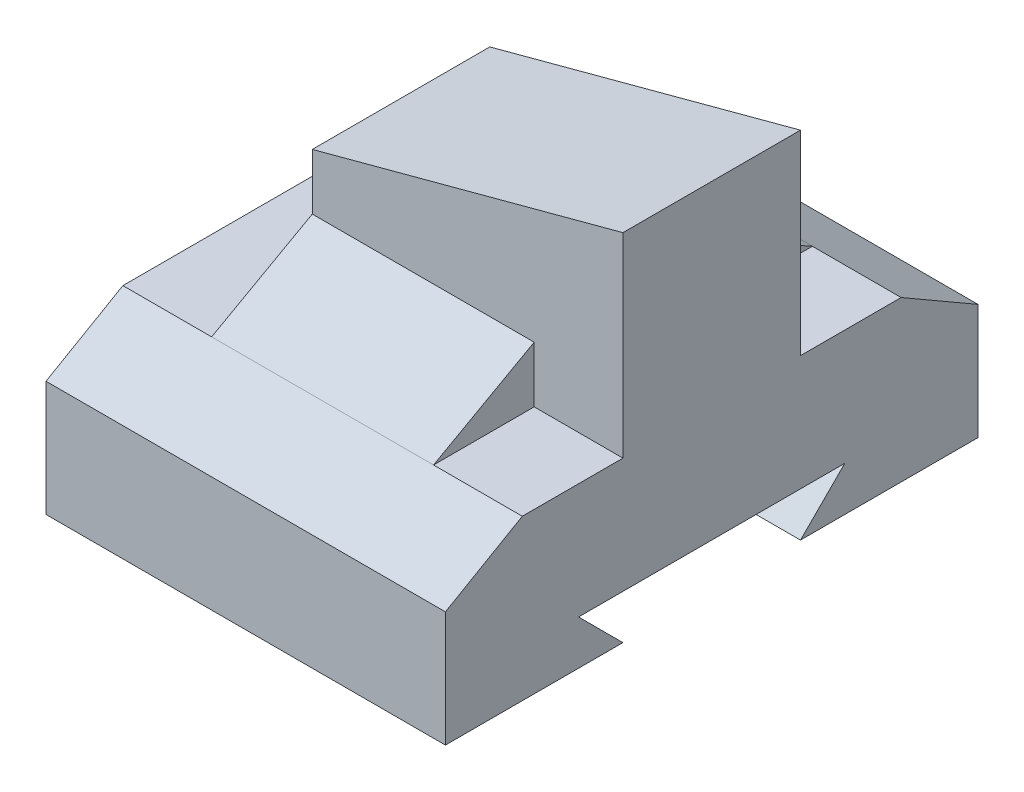
ISO-10303-21;
HEADER;
FILE_DESCRIPTION(('STEP AP214'),'2;1');
FILE_NAME('part.step','',(''),(''),'','','');
FILE_SCHEMA(('AUTOMOTIVE_DESIGN { 1 0 10303 214 1 1 1 1 }'));
ENDSEC;
DATA;
#1=APPLICATION_CONTEXT('core data for automotive mechanical design processes');
#2=APPLICATION_PROTOCOL_DEFINITION('international standard','automotive_design',2000,#1);
#3=PRODUCT_CONTEXT('',#1,'mechanical');
#4=PRODUCT('Part','Part','',(#3));
#5=PRODUCT_RELATED_PRODUCT_CATEGORY('part','',(#4));
#6=PRODUCT_DEFINITION_FORMATION('','',#4);
#7=PRODUCT_DEFINITION_CONTEXT('part definition',#1,'design');
#8=PRODUCT_DEFINITION('design','',#6,#7);
#9=PRODUCT_DEFINITION_SHAPE('','',#8);
#10=(LENGTH_UNIT() NAMED_UNIT(*) SI_UNIT(.MILLI.,.METRE.));
#11=(NAMED_UNIT(*) PLANE_ANGLE_UNIT() SI_UNIT($,.RADIAN.));
#12=(NAMED_UNIT(*) SI_UNIT($,.STERADIAN.) SOLID_ANGLE_UNIT());
#13=UNCERTAINTY_MEASURE_WITH_UNIT(LENGTH_MEASURE(1.E-05),#10,'distance_accuracy_value','');
#14=(GEOMETRIC_REPRESENTATION_CONTEXT(3) GLOBAL_UNCERTAINTY_ASSIGNED_CONTEXT((#13)) GLOBAL_UNIT_ASSIGNED_CONTEXT((#10,
#11,#12)) REPRESENTATION_CONTEXT('',''));
#15=CARTESIAN_POINT('',(0.,0.,0.));
#16=DIRECTION('',(0.,0.,1.));
#17=DIRECTION('',(1.,0.,0.));
#18=AXIS2_PLACEMENT_3D('',#15,#16,#17);
#19=CARTESIAN_POINT('',(-9.99999999999999,18.,40.));
#20=DIRECTION('',(0.,-1.,0.));
#21=DIRECTION('',(0.,0.,-1.));
#22=AXIS2_PLACEMENT_3D('',#19,#20,#21);
#23=PLANE('',#22);
#24=DIRECTION('',(0.,0.,1.));
#25=VECTOR('',#24,1.);
#26=CARTESIAN_POINT('',(-35.,18.,40.));
#27=LINE('',#26,#25);
#28=CARTESIAN_POINT('',(-35.,18.,40.));
#29=VERTEX_POINT('',#28);
#30=CARTESIAN_POINT('',(-35.,18.,51.3397459621557));
#31=VERTEX_POINT('',#30);
#32=EDGE_CURVE('E102',#29,#31,#27,.T.);
#33=ORIENTED_EDGE('',*,*,#32,.F.);
#34=DIRECTION('',(-1.,0.,0.));
#35=VECTOR('',#34,1.);
#36=CARTESIAN_POINT('',(-9.99999999999999,18.,40.));
#37=LINE('',#36,#35);
#38=CARTESIAN_POINT('',(-9.99999999999999,18.,40.));
#39=VERTEX_POINT('',#38);
#40=EDGE_CURVE('E12',#39,#29,#37,.T.);
#41=ORIENTED_EDGE('',*,*,#40,.F.);
#42=DIRECTION('',(0.,0.,1.));
#43=VECTOR('',#42,1.);
#44=CARTESIAN_POINT('',(-9.99999999999999,18.,40.));
#45=LINE('',#44,#43);
#46=CARTESIAN_POINT('',(-9.99999999999999,18.,51.3397459621557));
#47=VERTEX_POINT('',#46);
#48=EDGE_CURVE('E94',#39,#47,#45,.T.);
#49=ORIENTED_EDGE('',*,*,#48,.T.);
#50=DIRECTION('',(-1.,0.,0.));
#51=VECTOR('',#50,1.);
#52=CARTESIAN_POINT('',(-9.99999999999999,18.,51.3397459621557));
#53=LINE('',#52,#51);
#54=EDGE_CURVE('E53',#47,#31,#53,.T.);
#55=ORIENTED_EDGE('',*,*,#54,.T.);
#56=EDGE_LOOP('',(#33,#41,#49,#55));
#57=FACE_BOUND('',#56,.T.);
#58=ADVANCED_FACE('F50',(#57),#23,.T.);
#59=CARTESIAN_POINT('',(-9.99999999999999,24.3108891324553,40.));
#60=DIRECTION('',(0.,0.,-1.));
#61=DIRECTION('',(-1.,0.,0.));
#62=AXIS2_PLACEMENT_3D('',#59,#60,#61);
#63=PLANE('',#62);
#64=DIRECTION('',(0.,-1.,0.));
#65=VECTOR('',#64,1.);
#66=CARTESIAN_POINT('',(-35.,24.3108891324553,40.));
#67=LINE('',#66,#65);
#68=CARTESIAN_POINT('',(-35.,24.3108891324553,40.));
#69=VERTEX_POINT('',#68);
#70=EDGE_CURVE('E96',#69,#29,#67,.T.);
#71=ORIENTED_EDGE('',*,*,#70,.F.);
#72=DIRECTION('',(-1.,0.,0.));
#73=VECTOR('',#72,1.);
#74=CARTESIAN_POINT('',(-9.99999999999999,24.3108891324553,40.));
#75=LINE('',#74,#73);
#76=CARTESIAN_POINT('',(-9.99999999999999,24.3108891324553,40.));
#77=VERTEX_POINT('',#76);
#78=EDGE_CURVE('E59',#77,#69,#75,.T.);
#79=ORIENTED_EDGE('',*,*,#78,.F.);
#80=DIRECTION('',(0.,-1.,0.));
#81=VECTOR('',#80,1.);
#82=CARTESIAN_POINT('',(-9.99999999999999,24.3108891324553,40.));
#83=LINE('',#82,#81);
#84=EDGE_CURVE('E91',#77,#39,#83,.T.);
#85=ORIENTED_EDGE('',*,*,#84,.T.);
#86=ORIENTED_EDGE('',*,*,#40,.T.);
#87=EDGE_LOOP('',(#71,#79,#85,#86));
#88=FACE_BOUND('',#87,.T.);
#89=ADVANCED_FACE('F106',(#88),#63,.T.);
#90=CARTESIAN_POINT('',(-9.99999999999999,18.,51.3397459621557));
#91=DIRECTION('',(0.,0.873796207523062,0.486292286303529));
#92=DIRECTION('',(0.,-0.486292286303529,0.873796207523062));
#93=AXIS2_PLACEMENT_3D('',#90,#91,#92);
#94=PLANE('',#93);
#95=DIRECTION('',(0.,0.486292286303529,-0.873796207523062));
#96=VECTOR('',#95,1.);
#97=CARTESIAN_POINT('',(-35.,18.,51.3397459621557));
#98=LINE('',#97,#96);
#99=EDGE_CURVE('E89',#31,#69,#98,.T.);
#100=ORIENTED_EDGE('',*,*,#99,.F.);
#101=ORIENTED_EDGE('',*,*,#54,.F.);
#102=DIRECTION('',(0.,0.486292286303529,-0.873796207523062));
#103=VECTOR('',#102,1.);
#104=CARTESIAN_POINT('',(-9.99999999999999,18.,51.3397459621557));
#105=LINE('',#104,#103);
#106=EDGE_CURVE('E87',#47,#77,#105,.T.);
#107=ORIENTED_EDGE('',*,*,#106,.T.);
#108=ORIENTED_EDGE('',*,*,#78,.T.);
#109=EDGE_LOOP('',(#100,#101,#107,#108));
#110=FACE_BOUND('',#109,.T.);
#111=ADVANCED_FACE('F86',(#110),#94,.T.);
#112=CARTESIAN_POINT('',(-9.99999999999999,0.,0.));
#113=DIRECTION('',(1.,0.,0.));
#114=DIRECTION('',(0.,0.,-1.));
#115=AXIS2_PLACEMENT_3D('',#112,#113,#114);
#116=PLANE('',#115);
#117=ORIENTED_EDGE('',*,*,#48,.F.);
#118=ORIENTED_EDGE('',*,*,#84,.F.);
#119=ORIENTED_EDGE('',*,*,#106,.F.);
#120=EDGE_LOOP('',(#117,#118,#119));
#121=FACE_BOUND('',#120,.T.);
#122=ADVANCED_FACE('F93',(#121),#116,.T.);
#123=CARTESIAN_POINT('',(-35.,0.,0.));
#124=DIRECTION('',(1.,0.,0.));
#125=DIRECTION('',(0.,0.,-1.));
#126=AXIS2_PLACEMENT_3D('',#123,#124,#125);
#127=PLANE('',#126);
#128=ORIENTED_EDGE('',*,*,#32,.T.);
#129=ORIENTED_EDGE('',*,*,#99,.T.);
#130=ORIENTED_EDGE('',*,*,#70,.T.);
#131=EDGE_LOOP('',(#128,#129,#130));
#132=FACE_BOUND('',#131,.T.);
#133=ADVANCED_FACE('F105',(#132),#127,.F.);
#134=CLOSED_SHELL('',(#58,#89,#111,#122,#133));
#135=MANIFOLD_SOLID_BREP('B2',#134);
#136=CARTESIAN_POINT('',(-9.99999999999999,18.,20.));
#137=DIRECTION('',(0.,-1.,0.));
#138=DIRECTION('',(0.,0.,-1.));
#139=AXIS2_PLACEMENT_3D('',#136,#137,#138);
#140=PLANE('',#139);
#141=DIRECTION('',(0.,0.,1.));
#142=VECTOR('',#141,1.);
#143=CARTESIAN_POINT('',(-35.,18.,20.));
#144=LINE('',#143,#142);
#145=CARTESIAN_POINT('',(-35.,18.,8.66025403784431));
#146=VERTEX_POINT('',#145);
#147=CARTESIAN_POINT('',(-35.,18.,20.));
#148=VERTEX_POINT('',#147);
#149=EDGE_CURVE('E209',#146,#148,#144,.T.);
#150=ORIENTED_EDGE('',*,*,#149,.F.);
#151=DIRECTION('',(-1.,0.,0.));
#152=VECTOR('',#151,1.);
#153=CARTESIAN_POINT('',(-9.99999999999999,18.,8.66025403784431));
#154=LINE('',#153,#152);
#155=CARTESIAN_POINT('',(-9.99999999999999,18.,8.66025403784431));
#156=VERTEX_POINT('',#155);
#157=EDGE_CURVE('E48',#156,#146,#154,.T.);
#158=ORIENTED_EDGE('',*,*,#157,.F.);
#159=DIRECTION('',(0.,0.,1.));
#160=VECTOR('',#159,1.);
#161=CARTESIAN_POINT('',(-9.99999999999999,18.,20.));
#162=LINE('',#161,#160);
#163=CARTESIAN_POINT('',(-9.99999999999999,18.,20.));
#164=VERTEX_POINT('',#163);
#165=EDGE_CURVE('E201',#156,#164,#162,.T.);
#166=ORIENTED_EDGE('',*,*,#165,.T.);
#167=DIRECTION('',(-1.,0.,0.));
#168=VECTOR('',#167,1.);
#169=CARTESIAN_POINT('',(-9.99999999999999,18.,20.));
#170=LINE('',#169,#168);
#171=EDGE_CURVE('E160',#164,#148,#170,.T.);
#172=ORIENTED_EDGE('',*,*,#171,.T.);
#173=EDGE_LOOP('',(#150,#158,#166,#172));
#174=FACE_BOUND('',#173,.T.);
#175=ADVANCED_FACE('F157',(#174),#140,.T.);
#176=CARTESIAN_POINT('',(-9.99999999999999,18.,8.66025403784431));
#177=DIRECTION('',(0.,0.873796207523062,-0.48629228630353));
#178=DIRECTION('',(0.,0.48629228630353,0.873796207523062));
#179=AXIS2_PLACEMENT_3D('',#176,#177,#178);
#180=PLANE('',#179);
#181=DIRECTION('',(0.,-0.48629228630353,-0.873796207523062));
#182=VECTOR('',#181,1.);
#183=CARTESIAN_POINT('',(-35.,18.,8.66025403784431));
#184=LINE('',#183,#182);
#185=CARTESIAN_POINT('',(-35.,24.3108891324553,20.));
#186=VERTEX_POINT('',#185);
#187=EDGE_CURVE('E203',#186,#146,#184,.T.);
#188=ORIENTED_EDGE('',*,*,#187,.F.);
#189=DIRECTION('',(-1.,0.,0.));
#190=VECTOR('',#189,1.);
#191=CARTESIAN_POINT('',(-9.99999999999999,24.3108891324553,20.));
#192=LINE('',#191,#190);
#193=CARTESIAN_POINT('',(-9.99999999999999,24.3108891324553,20.));
#194=VERTEX_POINT('',#193);
#195=EDGE_CURVE('E166',#194,#186,#192,.T.);
#196=ORIENTED_EDGE('',*,*,#195,.F.);
#197=DIRECTION('',(0.,-0.48629228630353,-0.873796207523062));
#198=VECTOR('',#197,1.);
#199=CARTESIAN_POINT('',(-9.99999999999999,18.,8.66025403784431));
#200=LINE('',#199,#198);
#201=EDGE_CURVE('E198',#194,#156,#200,.T.);
#202=ORIENTED_EDGE('',*,*,#201,.T.);
#203=ORIENTED_EDGE('',*,*,#157,.T.);
#204=EDGE_LOOP('',(#188,#196,#202,#203));
#205=FACE_BOUND('',#204,.T.);
#206=ADVANCED_FACE('F213',(#205),#180,.T.);
#207=CARTESIAN_POINT('',(-9.99999999999999,24.3108891324553,20.));
#208=DIRECTION('',(0.,0.,1.));
#209=DIRECTION('',(1.,0.,0.));
#210=AXIS2_PLACEMENT_3D('',#207,#208,#209);
#211=PLANE('',#210);
#212=DIRECTION('',(0.,1.,0.));
#213=VECTOR('',#212,1.);
#214=CARTESIAN_POINT('',(-35.,24.3108891324553,20.));
#215=LINE('',#214,#213);
#216=EDGE_CURVE('E196',#148,#186,#215,.T.);
#217=ORIENTED_EDGE('',*,*,#216,.F.);
#218=ORIENTED_EDGE('',*,*,#171,.F.);
#219=DIRECTION('',(0.,1.,0.));
#220=VECTOR('',#219,1.);
#221=CARTESIAN_POINT('',(-9.99999999999999,24.3108891324553,20.));
#222=LINE('',#221,#220);
#223=EDGE_CURVE('E194',#164,#194,#222,.T.);
#224=ORIENTED_EDGE('',*,*,#223,.T.);
#225=ORIENTED_EDGE('',*,*,#195,.T.);
#226=EDGE_LOOP('',(#217,#218,#224,#225));
#227=FACE_BOUND('',#226,.T.);
#228=ADVANCED_FACE('F193',(#227),#211,.T.);
#229=CARTESIAN_POINT('',(-9.99999999999999,0.,0.));
#230=DIRECTION('',(-1.,0.,0.));
#231=DIRECTION('',(0.,0.,1.));
#232=AXIS2_PLACEMENT_3D('',#229,#230,#231);
#233=PLANE('',#232);
#234=ORIENTED_EDGE('',*,*,#165,.F.);
#235=ORIENTED_EDGE('',*,*,#201,.F.);
#236=ORIENTED_EDGE('',*,*,#223,.F.);
#237=EDGE_LOOP('',(#234,#235,#236));
#238=FACE_BOUND('',#237,.T.);
#239=ADVANCED_FACE('F200',(#238),#233,.F.);
#240=CARTESIAN_POINT('',(-35.,0.,0.));
#241=DIRECTION('',(-1.,0.,0.));
#242=DIRECTION('',(0.,0.,1.));
#243=AXIS2_PLACEMENT_3D('',#240,#241,#242);
#244=PLANE('',#243);
#245=ORIENTED_EDGE('',*,*,#149,.T.);
#246=ORIENTED_EDGE('',*,*,#216,.T.);
#247=ORIENTED_EDGE('',*,*,#187,.T.);
#248=EDGE_LOOP('',(#245,#246,#247));
#249=FACE_BOUND('',#248,.T.);
#250=ADVANCED_FACE('F212',(#249),#244,.T.);
#251=CLOSED_SHELL('',(#175,#206,#228,#239,#250));
#252=MANIFOLD_SOLID_BREP('B6',#251);
#253=CARTESIAN_POINT('',(-45.,0.,60.));
#254=DIRECTION('',(0.,-1.,0.));
#255=DIRECTION('',(0.,0.,-1.));
#256=AXIS2_PLACEMENT_3D('',#253,#254,#255);
#257=PLANE('',#256);
#258=DIRECTION('',(0.,0.,-1.));
#259=VECTOR('',#258,1.);
#260=CARTESIAN_POINT('',(0.,0.,60.));
#261=LINE('',#260,#259);
#262=CARTESIAN_POINT('',(0.,0.,60.));
#263=VERTEX_POINT('',#262);
#264=CARTESIAN_POINT('',(0.,0.,40.));
#265=VERTEX_POINT('',#264);
#266=EDGE_CURVE('E392',#263,#265,#261,.T.);
#267=ORIENTED_EDGE('',*,*,#266,.F.);
#268=DIRECTION('',(1.,0.,0.));
#269=VECTOR('',#268,1.);
#270=CARTESIAN_POINT('',(-45.,0.,60.));
#271=LINE('',#270,#269);
#272=CARTESIAN_POINT('',(-45.,0.,60.));
#273=VERTEX_POINT('',#272);
#274=EDGE_CURVE('E155',#273,#263,#271,.T.);
#275=ORIENTED_EDGE('',*,*,#274,.F.);
#276=DIRECTION('',(0.,0.,-1.));
#277=VECTOR('',#276,1.);
#278=CARTESIAN_POINT('',(-45.,0.,60.));
#279=LINE('',#278,#277);
#280=CARTESIAN_POINT('',(-45.,0.,40.));
#281=VERTEX_POINT('',#280);
#282=EDGE_CURVE('E396',#273,#281,#279,.T.);
#283=ORIENTED_EDGE('',*,*,#282,.T.);
#284=DIRECTION('',(1.,0.,0.));
#285=VECTOR('',#284,1.);
#286=CARTESIAN_POINT('',(-45.,0.,40.));
#287=LINE('',#286,#285);
#288=EDGE_CURVE('E258',#281,#265,#287,.T.);
#289=ORIENTED_EDGE('',*,*,#288,.T.);
#290=EDGE_LOOP('',(#267,#275,#283,#289));
#291=FACE_BOUND('',#290,.T.);
#292=ADVANCED_FACE('F255',(#291),#257,.T.);
#293=CARTESIAN_POINT('',(-45.,13.,60.));
#294=DIRECTION('',(0.,0.,1.));
#295=DIRECTION('',(1.,0.,0.));
#296=AXIS2_PLACEMENT_3D('',#293,#294,#295);
#297=PLANE('',#296);
#298=DIRECTION('',(0.,-1.,0.));
#299=VECTOR('',#298,1.);
#300=CARTESIAN_POINT('',(0.,13.,60.));
#301=LINE('',#300,#299);
#302=CARTESIAN_POINT('',(0.,13.,60.));
#303=VERTEX_POINT('',#302);
#304=EDGE_CURVE('E401',#303,#263,#301,.T.);
#305=ORIENTED_EDGE('',*,*,#304,.F.);
#306=DIRECTION('',(1.,0.,0.));
#307=VECTOR('',#306,1.);
#308=CARTESIAN_POINT('',(-45.,13.,60.));
#309=LINE('',#308,#307);
#310=CARTESIAN_POINT('',(-45.,13.,60.));
#311=VERTEX_POINT('',#310);
#312=EDGE_CURVE('E264',#311,#303,#309,.T.);
#313=ORIENTED_EDGE('',*,*,#312,.F.);
#314=DIRECTION('',(0.,-1.,0.));
#315=VECTOR('',#314,1.);
#316=CARTESIAN_POINT('',(-45.,13.,60.));
#317=LINE('',#316,#315);
#318=EDGE_CURVE('E433',#311,#273,#317,.T.);
#319=ORIENTED_EDGE('',*,*,#318,.T.);
#320=ORIENTED_EDGE('',*,*,#274,.T.);
#321=EDGE_LOOP('',(#305,#313,#319,#320));
#322=FACE_BOUND('',#321,.T.);
#323=ADVANCED_FACE('F506',(#322),#297,.T.);
#324=CARTESIAN_POINT('',(-45.,18.,51.3397459621557));
#325=DIRECTION('',(0.,0.866025403784436,0.500000000000004));
#326=DIRECTION('',(0.,-0.500000000000004,0.866025403784436));
#327=AXIS2_PLACEMENT_3D('',#324,#325,#326);
#328=PLANE('',#327);
#329=DIRECTION('',(0.,-0.500000000000004,0.866025403784436));
#330=VECTOR('',#329,1.);
#331=CARTESIAN_POINT('',(0.,18.,51.3397459621557));
#332=LINE('',#331,#330);
#333=CARTESIAN_POINT('',(0.,18.,51.3397459621557));
#334=VERTEX_POINT('',#333);
#335=EDGE_CURVE('E465',#334,#303,#332,.T.);
#336=ORIENTED_EDGE('',*,*,#335,.F.);
#337=DIRECTION('',(1.,0.,0.));
#338=VECTOR('',#337,1.);
#339=CARTESIAN_POINT('',(-45.,18.,51.3397459621557));
#340=LINE('',#339,#338);
#341=CARTESIAN_POINT('',(-45.,18.,51.3397459621557));
#342=VERTEX_POINT('',#341);
#343=EDGE_CURVE('E474',#342,#334,#340,.T.);
#344=ORIENTED_EDGE('',*,*,#343,.F.);
#345=DIRECTION('',(0.,-0.500000000000004,0.866025403784436));
#346=VECTOR('',#345,1.);
#347=CARTESIAN_POINT('',(-45.,18.,51.3397459621557));
#348=LINE('',#347,#346);
#349=EDGE_CURVE('E429',#342,#311,#348,.T.);
#350=ORIENTED_EDGE('',*,*,#349,.T.);
#351=ORIENTED_EDGE('',*,*,#312,.T.);
#352=EDGE_LOOP('',(#336,#344,#350,#351));
#353=FACE_BOUND('',#352,.T.);
#354=ADVANCED_FACE('F550',(#353),#328,.T.);
#355=CARTESIAN_POINT('',(-45.,18.,8.66025403784431));
#356=DIRECTION('',(0.,1.,0.));
#357=DIRECTION('',(0.,0.,1.));
#358=AXIS2_PLACEMENT_3D('',#355,#356,#357);
#359=PLANE('',#358);
#360=DIRECTION('',(1.,0.,0.));
#361=VECTOR('',#360,1.);
#362=CARTESIAN_POINT('',(-35.,18.,40.));
#363=LINE('',#362,#361);
#364=CARTESIAN_POINT('',(-35.,18.,40.));
#365=VERTEX_POINT('',#364);
#366=CARTESIAN_POINT('',(0.,18.,40.));
#367=VERTEX_POINT('',#366);
#368=EDGE_CURVE('E389',#365,#367,#363,.T.);
#369=ORIENTED_EDGE('',*,*,#368,.F.);
#370=DIRECTION('',(0.,0.,-1.));
#371=VECTOR('',#370,1.);
#372=CARTESIAN_POINT('',(-35.,18.,40.));
#373=LINE('',#372,#371);
#374=CARTESIAN_POINT('',(-35.,18.,20.));
#375=VERTEX_POINT('',#374);
#376=EDGE_CURVE('E388',#365,#375,#373,.T.);
#377=ORIENTED_EDGE('',*,*,#376,.T.);
#378=DIRECTION('',(1.,0.,0.));
#379=VECTOR('',#378,1.);
#380=CARTESIAN_POINT('',(-35.,18.,20.));
#381=LINE('',#380,#379);
#382=CARTESIAN_POINT('',(0.,18.,20.));
#383=VERTEX_POINT('',#382);
#384=EDGE_CURVE('E393',#375,#383,#381,.T.);
#385=ORIENTED_EDGE('',*,*,#384,.T.);
#386=DIRECTION('',(0.,0.,1.));
#387=VECTOR('',#386,1.);
#388=CARTESIAN_POINT('',(0.,18.,8.66025403784431));
#389=LINE('',#388,#387);
#390=CARTESIAN_POINT('',(0.,18.,8.66025403784431));
#391=VERTEX_POINT('',#390);
#392=EDGE_CURVE('E376',#391,#383,#389,.T.);
#393=ORIENTED_EDGE('',*,*,#392,.F.);
#394=DIRECTION('',(1.,0.,0.));
#395=VECTOR('',#394,1.);
#396=CARTESIAN_POINT('',(-45.,18.,8.66025403784431));
#397=LINE('',#396,#395);
#398=CARTESIAN_POINT('',(-45.,18.,8.66025403784431));
#399=VERTEX_POINT('',#398);
#400=EDGE_CURVE('E478',#399,#391,#397,.T.);
#401=ORIENTED_EDGE('',*,*,#400,.F.);
#402=DIRECTION('',(0.,0.,1.));
#403=VECTOR('',#402,1.);
#404=CARTESIAN_POINT('',(-45.,18.,8.66025403784431));
#405=LINE('',#404,#403);
#406=EDGE_CURVE('E425',#399,#342,#405,.T.);
#407=ORIENTED_EDGE('',*,*,#406,.T.);
#408=ORIENTED_EDGE('',*,*,#343,.T.);
#409=EDGE_CURVE('E462',#367,#334,#389,.T.);
#410=ORIENTED_EDGE('',*,*,#409,.F.);
#411=EDGE_LOOP('',(#369,#377,#385,#393,#401,#407,#408,#410));
#412=FACE_BOUND('',#411,.T.);
#413=ADVANCED_FACE('F533',(#412),#359,.T.);
#414=CARTESIAN_POINT('',(-45.,13.0000000000001,0.));
#415=DIRECTION('',(0.,0.86602540378444,-0.499999999999998));
#416=DIRECTION('',(0.,0.499999999999998,0.86602540378444));
#417=AXIS2_PLACEMENT_3D('',#414,#415,#416);
#418=PLANE('',#417);
#419=DIRECTION('',(0.,0.499999999999998,0.86602540378444));
#420=VECTOR('',#419,1.);
#421=CARTESIAN_POINT('',(0.,13.0000000000001,0.));
#422=LINE('',#421,#420);
#423=CARTESIAN_POINT('',(0.,13.0000000000001,0.));
#424=VERTEX_POINT('',#423);
#425=EDGE_CURVE('E459',#424,#391,#422,.T.);
#426=ORIENTED_EDGE('',*,*,#425,.F.);
#427=DIRECTION('',(1.,0.,0.));
#428=VECTOR('',#427,1.);
#429=CARTESIAN_POINT('',(-45.,13.0000000000001,0.));
#430=LINE('',#429,#428);
#431=CARTESIAN_POINT('',(-45.,13.0000000000001,0.));
#432=VERTEX_POINT('',#431);
#433=EDGE_CURVE('E481',#432,#424,#430,.T.);
#434=ORIENTED_EDGE('',*,*,#433,.F.);
#435=DIRECTION('',(0.,0.499999999999998,0.86602540378444));
#436=VECTOR('',#435,1.);
#437=CARTESIAN_POINT('',(-45.,13.0000000000001,0.));
#438=LINE('',#437,#436);
#439=EDGE_CURVE('E421',#432,#399,#438,.T.);
#440=ORIENTED_EDGE('',*,*,#439,.T.);
#441=ORIENTED_EDGE('',*,*,#400,.T.);
#442=EDGE_LOOP('',(#426,#434,#440,#441));
#443=FACE_BOUND('',#442,.T.);
#444=ADVANCED_FACE('F528',(#443),#418,.T.);
#445=CARTESIAN_POINT('',(-45.,0.,0.));
#446=DIRECTION('',(0.,0.,-1.));
#447=DIRECTION('',(0.,1.,0.));
#448=AXIS2_PLACEMENT_3D('',#445,#446,#447);
#449=PLANE('',#448);
#450=DIRECTION('',(0.,1.,0.));
#451=VECTOR('',#450,1.);
#452=CARTESIAN_POINT('',(0.,0.,0.));
#453=LINE('',#452,#451);
#454=CARTESIAN_POINT('',(0.,0.,0.));
#455=VERTEX_POINT('',#454);
#456=EDGE_CURVE('E455',#455,#424,#453,.T.);
#457=ORIENTED_EDGE('',*,*,#456,.F.);
#458=DIRECTION('',(1.,0.,0.));
#459=VECTOR('',#458,1.);
#460=CARTESIAN_POINT('',(-45.,0.,0.));
#461=LINE('',#460,#459);
#462=CARTESIAN_POINT('',(-45.,0.,0.));
#463=VERTEX_POINT('',#462);
#464=EDGE_CURVE('E484',#463,#455,#461,.T.);
#465=ORIENTED_EDGE('',*,*,#464,.F.);
#466=DIRECTION('',(0.,1.,0.));
#467=VECTOR('',#466,1.);
#468=CARTESIAN_POINT('',(-45.,0.,0.));
#469=LINE('',#468,#467);
#470=EDGE_CURVE('E417',#463,#432,#469,.T.);
#471=ORIENTED_EDGE('',*,*,#470,.T.);
#472=ORIENTED_EDGE('',*,*,#433,.T.);
#473=EDGE_LOOP('',(#457,#465,#471,#472));
#474=FACE_BOUND('',#473,.T.);
#475=ADVANCED_FACE('F525',(#474),#449,.T.);
#476=CARTESIAN_POINT('',(-45.,0.,20.));
#477=DIRECTION('',(0.,-1.,0.));
#478=DIRECTION('',(0.,0.,-1.));
#479=AXIS2_PLACEMENT_3D('',#476,#477,#478);
#480=PLANE('',#479);
#481=DIRECTION('',(0.,0.,-1.));
#482=VECTOR('',#481,1.);
#483=CARTESIAN_POINT('',(0.,0.,20.));
#484=LINE('',#483,#482);
#485=CARTESIAN_POINT('',(0.,0.,20.));
#486=VERTEX_POINT('',#485);
#487=EDGE_CURVE('E451',#486,#455,#484,.T.);
#488=ORIENTED_EDGE('',*,*,#487,.F.);
#489=DIRECTION('',(1.,0.,0.));
#490=VECTOR('',#489,1.);
#491=CARTESIAN_POINT('',(-45.,0.,20.));
#492=LINE('',#491,#490);
#493=CARTESIAN_POINT('',(-45.,0.,20.));
#494=VERTEX_POINT('',#493);
#495=EDGE_CURVE('E487',#494,#486,#492,.T.);
#496=ORIENTED_EDGE('',*,*,#495,.F.);
#497=DIRECTION('',(0.,0.,-1.));
#498=VECTOR('',#497,1.);
#499=CARTESIAN_POINT('',(-45.,0.,20.));
#500=LINE('',#499,#498);
#501=EDGE_CURVE('E413',#494,#463,#500,.T.);
#502=ORIENTED_EDGE('',*,*,#501,.T.);
#503=ORIENTED_EDGE('',*,*,#464,.T.);
#504=EDGE_LOOP('',(#488,#496,#502,#503));
#505=FACE_BOUND('',#504,.T.);
#506=ADVANCED_FACE('F521',(#505),#480,.T.);
#507=CARTESIAN_POINT('',(-45.,5.,15.));
#508=DIRECTION('',(0.,0.707106781186549,0.707106781186546));
#509=DIRECTION('',(0.,-0.707106781186546,0.707106781186549));
#510=AXIS2_PLACEMENT_3D('',#507,#508,#509);
#511=PLANE('',#510);
#512=DIRECTION('',(0.,-0.707106781186546,0.707106781186549));
#513=VECTOR('',#512,1.);
#514=CARTESIAN_POINT('',(0.,5.,15.));
#515=LINE('',#514,#513);
#516=CARTESIAN_POINT('',(0.,5.,15.));
#517=VERTEX_POINT('',#516);
#518=EDGE_CURVE('E447',#517,#486,#515,.T.);
#519=ORIENTED_EDGE('',*,*,#518,.F.);
#520=DIRECTION('',(1.,0.,0.));
#521=VECTOR('',#520,1.);
#522=CARTESIAN_POINT('',(-45.,5.,15.));
#523=LINE('',#522,#521);
#524=CARTESIAN_POINT('',(-45.,5.,15.));
#525=VERTEX_POINT('',#524);
#526=EDGE_CURVE('E490',#525,#517,#523,.T.);
#527=ORIENTED_EDGE('',*,*,#526,.F.);
#528=DIRECTION('',(0.,-0.707106781186546,0.707106781186549));
#529=VECTOR('',#528,1.);
#530=CARTESIAN_POINT('',(-45.,5.,15.));
#531=LINE('',#530,#529);
#532=EDGE_CURVE('E409',#525,#494,#531,.T.);
#533=ORIENTED_EDGE('',*,*,#532,.T.);
#534=ORIENTED_EDGE('',*,*,#495,.T.);
#535=EDGE_LOOP('',(#519,#527,#533,#534));
#536=FACE_BOUND('',#535,.T.);
#537=ADVANCED_FACE('F519',(#536),#511,.T.);
#538=CARTESIAN_POINT('',(-45.,5.,45.));
#539=DIRECTION('',(0.,-1.,0.));
#540=DIRECTION('',(0.,0.,-1.));
#541=AXIS2_PLACEMENT_3D('',#538,#539,#540);
#542=PLANE('',#541);
#543=DIRECTION('',(0.,0.,-1.));
#544=VECTOR('',#543,1.);
#545=CARTESIAN_POINT('',(0.,5.,45.));
#546=LINE('',#545,#544);
#547=CARTESIAN_POINT('',(0.,5.,45.));
#548=VERTEX_POINT('',#547);
#549=EDGE_CURVE('E443',#548,#517,#546,.T.);
#550=ORIENTED_EDGE('',*,*,#549,.F.);
#551=DIRECTION('',(1.,0.,0.));
#552=VECTOR('',#551,1.);
#553=CARTESIAN_POINT('',(-45.,5.,45.));
#554=LINE('',#553,#552);
#555=CARTESIAN_POINT('',(-45.,5.,45.));
#556=VERTEX_POINT('',#555);
#557=EDGE_CURVE('E492',#556,#548,#554,.T.);
#558=ORIENTED_EDGE('',*,*,#557,.F.);
#559=DIRECTION('',(0.,0.,-1.));
#560=VECTOR('',#559,1.);
#561=CARTESIAN_POINT('',(-45.,5.,45.));
#562=LINE('',#561,#560);
#563=EDGE_CURVE('E405',#556,#525,#562,.T.);
#564=ORIENTED_EDGE('',*,*,#563,.T.);
#565=ORIENTED_EDGE('',*,*,#526,.T.);
#566=EDGE_LOOP('',(#550,#558,#564,#565));
#567=FACE_BOUND('',#566,.T.);
#568=ADVANCED_FACE('F515',(#567),#542,.T.);
#569=CARTESIAN_POINT('',(-45.,0.,40.));
#570=DIRECTION('',(0.,0.707106781186548,-0.707106781186547));
#571=DIRECTION('',(0.,0.707106781186547,0.707106781186548));
#572=AXIS2_PLACEMENT_3D('',#569,#570,#571);
#573=PLANE('',#572);
#574=DIRECTION('',(0.,0.707106781186547,0.707106781186548));
#575=VECTOR('',#574,1.);
#576=CARTESIAN_POINT('',(0.,0.,40.));
#577=LINE('',#576,#575);
#578=EDGE_CURVE('E439',#265,#548,#577,.T.);
#579=ORIENTED_EDGE('',*,*,#578,.F.);
#580=ORIENTED_EDGE('',*,*,#288,.F.);
#581=DIRECTION('',(0.,0.707106781186547,0.707106781186548));
#582=VECTOR('',#581,1.);
#583=CARTESIAN_POINT('',(-45.,0.,40.));
#584=LINE('',#583,#582);
#585=EDGE_CURVE('E400',#281,#556,#584,.T.);
#586=ORIENTED_EDGE('',*,*,#585,.T.);
#587=ORIENTED_EDGE('',*,*,#557,.T.);
#588=EDGE_LOOP('',(#579,#580,#586,#587));
#589=FACE_BOUND('',#588,.T.);
#590=ADVANCED_FACE('F502',(#589),#573,.T.);
#591=CARTESIAN_POINT('',(-45.,0.,0.));
#592=DIRECTION('',(1.,0.,0.));
#593=DIRECTION('',(0.,0.,-1.));
#594=AXIS2_PLACEMENT_3D('',#591,#592,#593);
#595=PLANE('',#594);
#596=ORIENTED_EDGE('',*,*,#282,.F.);
#597=ORIENTED_EDGE('',*,*,#318,.F.);
#598=ORIENTED_EDGE('',*,*,#349,.F.);
#599=ORIENTED_EDGE('',*,*,#406,.F.);
#600=ORIENTED_EDGE('',*,*,#439,.F.);
#601=ORIENTED_EDGE('',*,*,#470,.F.);
#602=ORIENTED_EDGE('',*,*,#501,.F.);
#603=ORIENTED_EDGE('',*,*,#532,.F.);
#604=ORIENTED_EDGE('',*,*,#563,.F.);
#605=ORIENTED_EDGE('',*,*,#585,.F.);
#606=EDGE_LOOP('',(#596,#597,#598,#599,#600,#601,#602,#603,#604,#605));
#607=FACE_BOUND('',#606,.T.);
#608=ADVANCED_FACE('F509',(#607),#595,.F.);
#609=CARTESIAN_POINT('',(0.,0.,0.));
#610=DIRECTION('',(1.,0.,0.));
#611=DIRECTION('',(0.,0.,-1.));
#612=AXIS2_PLACEMENT_3D('',#609,#610,#611);
#613=PLANE('',#612);
#614=ORIENTED_EDGE('',*,*,#266,.T.);
#615=ORIENTED_EDGE('',*,*,#578,.T.);
#616=ORIENTED_EDGE('',*,*,#549,.T.);
#617=ORIENTED_EDGE('',*,*,#518,.T.);
#618=ORIENTED_EDGE('',*,*,#487,.T.);
#619=ORIENTED_EDGE('',*,*,#456,.T.);
#620=ORIENTED_EDGE('',*,*,#425,.T.);
#621=ORIENTED_EDGE('',*,*,#392,.T.);
#622=DIRECTION('',(0.,1.,0.));
#623=VECTOR('',#622,1.);
#624=CARTESIAN_POINT('',(0.,40.,20.));
#625=LINE('',#624,#623);
#626=CARTESIAN_POINT('',(0.,40.,20.));
#627=VERTEX_POINT('',#626);
#628=EDGE_CURVE('E279',#383,#627,#625,.T.);
#629=ORIENTED_EDGE('',*,*,#628,.T.);
#630=DIRECTION('',(0.,0.,1.));
#631=VECTOR('',#630,1.);
#632=CARTESIAN_POINT('',(0.,40.,40.));
#633=LINE('',#632,#631);
#634=CARTESIAN_POINT('',(0.,40.,40.));
#635=VERTEX_POINT('',#634);
#636=EDGE_CURVE('E355',#627,#635,#633,.T.);
#637=ORIENTED_EDGE('',*,*,#636,.T.);
#638=DIRECTION('',(0.,-1.,0.));
#639=VECTOR('',#638,1.);
#640=CARTESIAN_POINT('',(0.,18.,40.));
#641=LINE('',#640,#639);
#642=EDGE_CURVE('E363',#635,#367,#641,.T.);
#643=ORIENTED_EDGE('',*,*,#642,.T.);
#644=ORIENTED_EDGE('',*,*,#409,.T.);
#645=ORIENTED_EDGE('',*,*,#335,.T.);
#646=ORIENTED_EDGE('',*,*,#304,.T.);
#647=EDGE_LOOP('',(#614,#615,#616,#617,#618,#619,#620,#621,#629,#637,#643,#644,#645,#646));
#648=FACE_BOUND('',#647,.T.);
#649=ADVANCED_FACE('F373',(#648),#613,.T.);
#650=CARTESIAN_POINT('',(-35.,18.,40.));
#651=DIRECTION('',(0.,0.,1.));
#652=DIRECTION('',(1.,0.,0.));
#653=AXIS2_PLACEMENT_3D('',#650,#651,#652);
#654=PLANE('',#653);
#655=DIRECTION('',(0.965925826289067,0.258819045102525,0.));
#656=VECTOR('',#655,1.);
#657=CARTESIAN_POINT('',(0.,40.,40.));
#658=LINE('',#657,#656);
#659=CARTESIAN_POINT('',(-35.,30.6217782649105,40.));
#660=VERTEX_POINT('',#659);
#661=EDGE_CURVE('E358',#660,#635,#658,.T.);
#662=ORIENTED_EDGE('',*,*,#661,.F.);
#663=DIRECTION('',(0.,-1.,0.));
#664=VECTOR('',#663,1.);
#665=CARTESIAN_POINT('',(-35.,18.,40.));
#666=LINE('',#665,#664);
#667=EDGE_CURVE('E383',#660,#365,#666,.T.);
#668=ORIENTED_EDGE('',*,*,#667,.T.);
#669=ORIENTED_EDGE('',*,*,#368,.T.);
#670=ORIENTED_EDGE('',*,*,#642,.F.);
#671=EDGE_LOOP('',(#662,#668,#669,#670));
#672=FACE_BOUND('',#671,.T.);
#673=ADVANCED_FACE('F546',(#672),#654,.T.);
#674=CARTESIAN_POINT('',(-35.,40.,20.));
#675=DIRECTION('',(0.,0.,-1.));
#676=DIRECTION('',(0.,1.,0.));
#677=AXIS2_PLACEMENT_3D('',#674,#675,#676);
#678=PLANE('',#677);
#679=DIRECTION('',(0.965925826289067,0.258819045102525,0.));
#680=VECTOR('',#679,1.);
#681=CARTESIAN_POINT('',(0.,40.,20.));
#682=LINE('',#681,#680);
#683=CARTESIAN_POINT('',(-35.,30.6217782649105,20.));
#684=VERTEX_POINT('',#683);
#685=EDGE_CURVE('E272',#684,#627,#682,.T.);
#686=ORIENTED_EDGE('',*,*,#685,.T.);
#687=ORIENTED_EDGE('',*,*,#628,.F.);
#688=ORIENTED_EDGE('',*,*,#384,.F.);
#689=DIRECTION('',(0.,1.,0.));
#690=VECTOR('',#689,1.);
#691=CARTESIAN_POINT('',(-35.,40.,20.));
#692=LINE('',#691,#690);
#693=EDGE_CURVE('E368',#375,#684,#692,.T.);
#694=ORIENTED_EDGE('',*,*,#693,.T.);
#695=EDGE_LOOP('',(#686,#687,#688,#694));
#696=FACE_BOUND('',#695,.T.);
#697=ADVANCED_FACE('F366',(#696),#678,.T.);
#698=CARTESIAN_POINT('',(-35.,0.,0.));
#699=DIRECTION('',(-1.,0.,0.));
#700=DIRECTION('',(0.,0.,1.));
#701=AXIS2_PLACEMENT_3D('',#698,#699,#700);
#702=PLANE('',#701);
#703=DIRECTION('',(0.,0.,1.));
#704=VECTOR('',#703,1.);
#705=CARTESIAN_POINT('',(-35.,30.6217782649105,-0.001000000000001));
#706=LINE('',#705,#704);
#707=EDGE_CURVE('E378',#684,#660,#706,.T.);
#708=ORIENTED_EDGE('',*,*,#707,.F.);
#709=ORIENTED_EDGE('',*,*,#693,.F.);
#710=ORIENTED_EDGE('',*,*,#376,.F.);
#711=ORIENTED_EDGE('',*,*,#667,.F.);
#712=EDGE_LOOP('',(#708,#709,#710,#711));
#713=FACE_BOUND('',#712,.T.);
#714=ADVANCED_FACE('F537',(#713),#702,.T.);
#715=CARTESIAN_POINT('',(0.,40.,-0.001000000000001));
#716=DIRECTION('',(0.258819045102525,-0.965925826289067,0.));
#717=DIRECTION('',(0.965925826289067,0.258819045102525,0.));
#718=AXIS2_PLACEMENT_3D('',#715,#716,#717);
#719=PLANE('',#718);
#720=ORIENTED_EDGE('',*,*,#707,.T.);
#721=ORIENTED_EDGE('',*,*,#661,.T.);
#722=ORIENTED_EDGE('',*,*,#636,.F.);
#723=ORIENTED_EDGE('',*,*,#685,.F.);
#724=EDGE_LOOP('',(#720,#721,#722,#723));
#725=FACE_BOUND('',#724,.T.);
#726=ADVANCED_FACE('F356',(#725),#719,.F.);
#727=CLOSED_SHELL('',(#292,#323,#354,#413,#444,#475,#506,#537,#568,#590,#608,#649,#673,#697,
#714,#726));
#728=MANIFOLD_SOLID_BREP('B42',#727);
#729=ADVANCED_BREP_SHAPE_REPRESENTATION('',(#18,#135,#252,#728),#14);
#730=SHAPE_DEFINITION_REPRESENTATION(#9,#729);
ENDSEC;
END-ISO-10303-21;
